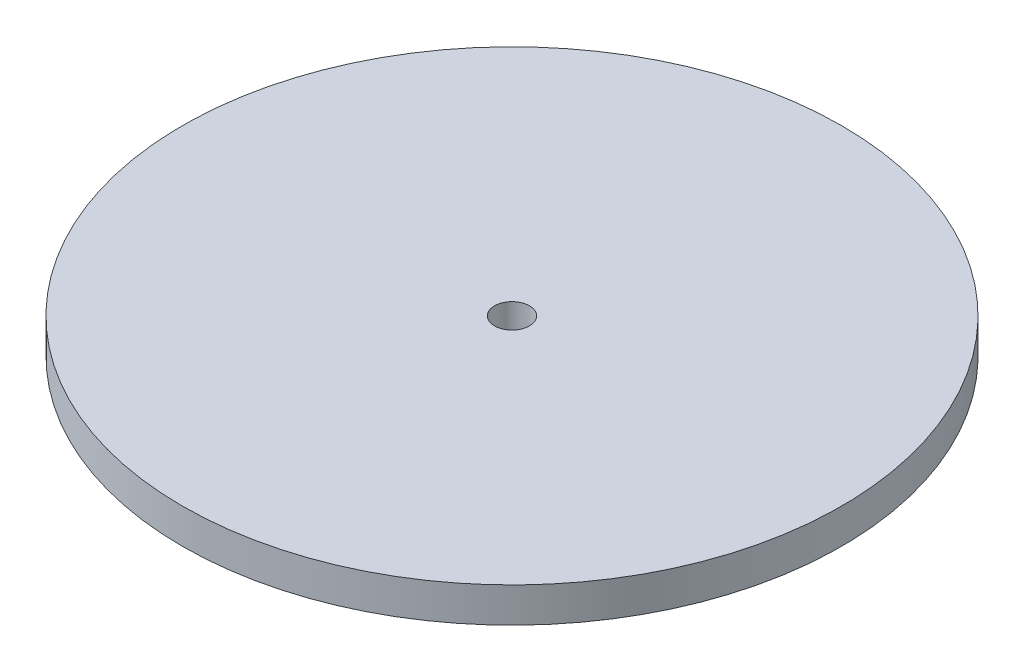
ISO-10303-21;
HEADER;
FILE_DESCRIPTION(('STEP AP214'),'2;1');
FILE_NAME('part.step','',(''),(''),'','','');
FILE_SCHEMA(('AUTOMOTIVE_DESIGN { 1 0 10303 214 1 1 1 1 }'));
ENDSEC;
DATA;
#1=APPLICATION_CONTEXT('core data for automotive mechanical design processes');
#2=APPLICATION_PROTOCOL_DEFINITION('international standard','automotive_design',2000,#1);
#3=PRODUCT_CONTEXT('',#1,'mechanical');
#4=PRODUCT('Part','Part','',(#3));
#5=PRODUCT_RELATED_PRODUCT_CATEGORY('part','',(#4));
#6=PRODUCT_DEFINITION_FORMATION('','',#4);
#7=PRODUCT_DEFINITION_CONTEXT('part definition',#1,'design');
#8=PRODUCT_DEFINITION('design','',#6,#7);
#9=PRODUCT_DEFINITION_SHAPE('','',#8);
#10=(LENGTH_UNIT() NAMED_UNIT(*) SI_UNIT(.MILLI.,.METRE.));
#11=(NAMED_UNIT(*) PLANE_ANGLE_UNIT() SI_UNIT($,.RADIAN.));
#12=(NAMED_UNIT(*) SI_UNIT($,.STERADIAN.) SOLID_ANGLE_UNIT());
#13=UNCERTAINTY_MEASURE_WITH_UNIT(LENGTH_MEASURE(1.E-05),#10,'distance_accuracy_value','');
#14=(GEOMETRIC_REPRESENTATION_CONTEXT(3) GLOBAL_UNCERTAINTY_ASSIGNED_CONTEXT((#13)) GLOBAL_UNIT_ASSIGNED_CONTEXT((#10,
#11,#12)) REPRESENTATION_CONTEXT('',''));
#15=CARTESIAN_POINT('',(0.,0.,0.));
#16=DIRECTION('',(0.,0.,1.));
#17=DIRECTION('',(1.,0.,0.));
#18=AXIS2_PLACEMENT_3D('',#15,#16,#17);
#19=CARTESIAN_POINT('',(0.,4.,0.));
#20=DIRECTION('',(0.,1.,0.));
#21=DIRECTION('',(0.,0.,1.));
#22=AXIS2_PLACEMENT_3D('',#19,#20,#21);
#23=PLANE('',#22);
#24=CARTESIAN_POINT('',(0.,4.,0.));
#25=DIRECTION('',(0.,1.,0.));
#26=DIRECTION('',(0.,0.,1.));
#27=AXIS2_PLACEMENT_3D('',#24,#25,#26);
#28=CIRCLE('',#27,37.8);
#29=CARTESIAN_POINT('',(0.,4.,37.8));
#30=VERTEX_POINT('',#29);
#31=EDGE_CURVE('E10',#30,#30,#28,.T.);
#32=ORIENTED_EDGE('',*,*,#31,.T.);
#33=EDGE_LOOP('',(#32));
#34=FACE_BOUND('',#33,.T.);
#35=CARTESIAN_POINT('',(0.,4.,0.));
#36=DIRECTION('',(0.,1.,0.));
#37=DIRECTION('',(0.,0.,1.));
#38=AXIS2_PLACEMENT_3D('',#35,#36,#37);
#39=CIRCLE('',#38,2.);
#40=CARTESIAN_POINT('',(0.,4.,2.));
#41=VERTEX_POINT('',#40);
#42=EDGE_CURVE('E44',#41,#41,#39,.T.);
#43=ORIENTED_EDGE('',*,*,#42,.F.);
#44=EDGE_LOOP('',(#43));
#45=FACE_BOUND('',#44,.T.);
#46=ADVANCED_FACE('F33',(#34,#45),#23,.T.);
#47=CARTESIAN_POINT('',(0.,0.,0.));
#48=DIRECTION('',(0.,1.,0.));
#49=DIRECTION('',(0.,0.,1.));
#50=AXIS2_PLACEMENT_3D('',#47,#48,#49);
#51=PLANE('',#50);
#52=CARTESIAN_POINT('',(0.,0.,0.));
#53=DIRECTION('',(0.,1.,0.));
#54=DIRECTION('',(0.,0.,1.));
#55=AXIS2_PLACEMENT_3D('',#52,#53,#54);
#56=CIRCLE('',#55,37.8);
#57=CARTESIAN_POINT('',(0.,0.,37.8));
#58=VERTEX_POINT('',#57);
#59=EDGE_CURVE('E37',#58,#58,#56,.T.);
#60=ORIENTED_EDGE('',*,*,#59,.F.);
#61=EDGE_LOOP('',(#60));
#62=FACE_BOUND('',#61,.T.);
#63=CARTESIAN_POINT('',(0.,0.,0.));
#64=DIRECTION('',(0.,1.,0.));
#65=DIRECTION('',(0.,0.,1.));
#66=AXIS2_PLACEMENT_3D('',#63,#64,#65);
#67=CIRCLE('',#66,2.);
#68=CARTESIAN_POINT('',(0.,0.,2.));
#69=VERTEX_POINT('',#68);
#70=EDGE_CURVE('E46',#69,#69,#67,.T.);
#71=ORIENTED_EDGE('',*,*,#70,.T.);
#72=EDGE_LOOP('',(#71));
#73=FACE_BOUND('',#72,.T.);
#74=ADVANCED_FACE('F56',(#62,#73),#51,.F.);
#75=CARTESIAN_POINT('',(0.,4.,0.));
#76=DIRECTION('',(0.,-1.,0.));
#77=DIRECTION('',(0.,0.,-1.));
#78=AXIS2_PLACEMENT_3D('',#75,#76,#77);
#79=CYLINDRICAL_SURFACE('',#78,37.8);
#80=ORIENTED_EDGE('',*,*,#31,.F.);
#81=EDGE_LOOP('',(#80));
#82=FACE_BOUND('',#81,.T.);
#83=ORIENTED_EDGE('',*,*,#59,.T.);
#84=EDGE_LOOP('',(#83));
#85=FACE_BOUND('',#84,.T.);
#86=ADVANCED_FACE('F35',(#82,#85),#79,.T.);
#87=CARTESIAN_POINT('',(0.,4.,0.));
#88=DIRECTION('',(0.,-1.,0.));
#89=DIRECTION('',(0.,0.,-1.));
#90=AXIS2_PLACEMENT_3D('',#87,#88,#89);
#91=CYLINDRICAL_SURFACE('',#90,2.);
#92=ORIENTED_EDGE('',*,*,#42,.T.);
#93=EDGE_LOOP('',(#92));
#94=FACE_BOUND('',#93,.T.);
#95=ORIENTED_EDGE('',*,*,#70,.F.);
#96=EDGE_LOOP('',(#95));
#97=FACE_BOUND('',#96,.T.);
#98=ADVANCED_FACE('F52',(#94,#97),#91,.F.);
#99=CLOSED_SHELL('',(#46,#74,#86,#98));
#100=MANIFOLD_SOLID_BREP('B2',#99);
#101=ADVANCED_BREP_SHAPE_REPRESENTATION('',(#18,#100),#14);
#102=SHAPE_DEFINITION_REPRESENTATION(#9,#101);
ENDSEC;
END-ISO-10303-21;
